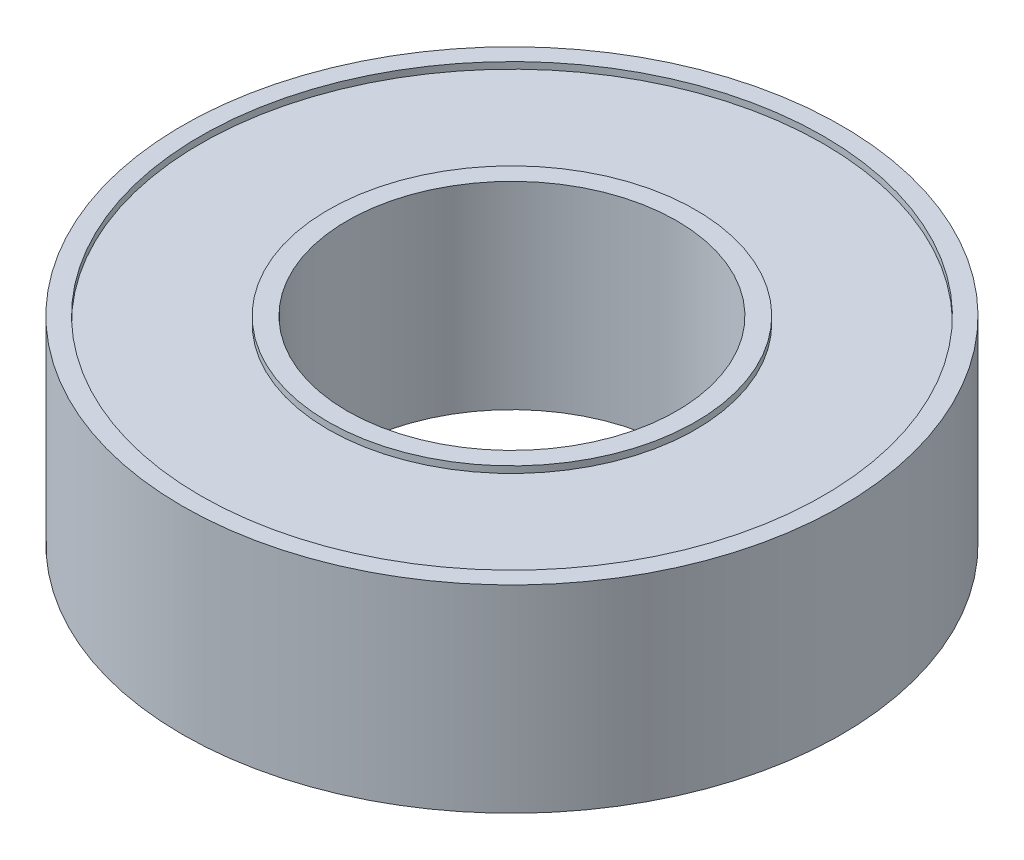
ISO-10303-21;
HEADER;
FILE_DESCRIPTION(('STEP AP214'),'2;1');
FILE_NAME('part.step','',(''),(''),'','','');
FILE_SCHEMA(('AUTOMOTIVE_DESIGN { 1 0 10303 214 1 1 1 1 }'));
ENDSEC;
DATA;
#1=APPLICATION_CONTEXT('core data for automotive mechanical design processes');
#2=APPLICATION_PROTOCOL_DEFINITION('international standard','automotive_design',2000,#1);
#3=PRODUCT_CONTEXT('',#1,'mechanical');
#4=PRODUCT('Part','Part','',(#3));
#5=PRODUCT_RELATED_PRODUCT_CATEGORY('part','',(#4));
#6=PRODUCT_DEFINITION_FORMATION('','',#4);
#7=PRODUCT_DEFINITION_CONTEXT('part definition',#1,'design');
#8=PRODUCT_DEFINITION('design','',#6,#7);
#9=PRODUCT_DEFINITION_SHAPE('','',#8);
#10=(LENGTH_UNIT() NAMED_UNIT(*) SI_UNIT(.MILLI.,.METRE.));
#11=(NAMED_UNIT(*) PLANE_ANGLE_UNIT() SI_UNIT($,.RADIAN.));
#12=(NAMED_UNIT(*) SI_UNIT($,.STERADIAN.) SOLID_ANGLE_UNIT());
#13=UNCERTAINTY_MEASURE_WITH_UNIT(LENGTH_MEASURE(1.E-05),#10,'distance_accuracy_value','');
#14=(GEOMETRIC_REPRESENTATION_CONTEXT(3) GLOBAL_UNCERTAINTY_ASSIGNED_CONTEXT((#13)) GLOBAL_UNIT_ASSIGNED_CONTEXT((#10,
#11,#12)) REPRESENTATION_CONTEXT('',''));
#15=CARTESIAN_POINT('',(0.,0.,0.));
#16=DIRECTION('',(0.,0.,1.));
#17=DIRECTION('',(1.,0.,0.));
#18=AXIS2_PLACEMENT_3D('',#15,#16,#17);
#19=CARTESIAN_POINT('',(0.,3.,0.));
#20=DIRECTION('',(0.,1.,0.));
#21=DIRECTION('',(0.,0.,1.));
#22=AXIS2_PLACEMENT_3D('',#19,#20,#21);
#23=PLANE('',#22);
#24=CARTESIAN_POINT('',(0.,3.,0.));
#25=DIRECTION('',(0.,1.,0.));
#26=DIRECTION('',(0.,0.,1.));
#27=AXIS2_PLACEMENT_3D('',#24,#25,#26);
#28=CIRCLE('',#27,2.5);
#29=CARTESIAN_POINT('',(0.,3.,2.5));
#30=VERTEX_POINT('',#29);
#31=EDGE_CURVE('E50',#30,#30,#28,.T.);
#32=ORIENTED_EDGE('',*,*,#31,.F.);
#33=EDGE_LOOP('',(#32));
#34=FACE_BOUND('',#33,.T.);
#35=CARTESIAN_POINT('',(0.,3.,0.));
#36=DIRECTION('',(0.,1.,0.));
#37=DIRECTION('',(0.,0.,1.));
#38=AXIS2_PLACEMENT_3D('',#35,#36,#37);
#39=CIRCLE('',#38,2.78728207243024);
#40=CARTESIAN_POINT('',(0.,3.,2.78728207243024));
#41=VERTEX_POINT('',#40);
#42=EDGE_CURVE('E84',#41,#41,#39,.T.);
#43=ORIENTED_EDGE('',*,*,#42,.T.);
#44=EDGE_LOOP('',(#43));
#45=FACE_BOUND('',#44,.T.);
#46=ADVANCED_FACE('F37',(#34,#45),#23,.T.);
#47=CARTESIAN_POINT('',(0.,0.,0.));
#48=DIRECTION('',(0.,1.,0.));
#49=DIRECTION('',(0.,0.,1.));
#50=AXIS2_PLACEMENT_3D('',#47,#48,#49);
#51=PLANE('',#50);
#52=CARTESIAN_POINT('',(0.,0.,0.));
#53=DIRECTION('',(0.,1.,0.));
#54=DIRECTION('',(0.,0.,1.));
#55=AXIS2_PLACEMENT_3D('',#52,#53,#54);
#56=CIRCLE('',#55,2.5);
#57=CARTESIAN_POINT('',(0.,0.,2.5));
#58=VERTEX_POINT('',#57);
#59=EDGE_CURVE('E52',#58,#58,#56,.T.);
#60=ORIENTED_EDGE('',*,*,#59,.T.);
#61=EDGE_LOOP('',(#60));
#62=FACE_BOUND('',#61,.T.);
#63=CARTESIAN_POINT('',(0.,0.,0.));
#64=DIRECTION('',(0.,-1.,0.));
#65=DIRECTION('',(0.,0.,-1.));
#66=AXIS2_PLACEMENT_3D('',#63,#64,#65);
#67=CIRCLE('',#66,2.78728207243024);
#68=CARTESIAN_POINT('',(0.,0.,-2.78728207243024));
#69=VERTEX_POINT('',#68);
#70=EDGE_CURVE('E68',#69,#69,#67,.T.);
#71=ORIENTED_EDGE('',*,*,#70,.T.);
#72=EDGE_LOOP('',(#71));
#73=FACE_BOUND('',#72,.T.);
#74=ADVANCED_FACE('F111',(#62,#73),#51,.F.);
#75=CARTESIAN_POINT('',(0.,3.,0.));
#76=DIRECTION('',(0.,1.,0.));
#77=DIRECTION('',(0.,0.,1.));
#78=AXIS2_PLACEMENT_3D('',#75,#76,#77);
#79=CIRCLE('',#78,4.72518957894101);
#80=CARTESIAN_POINT('',(0.,3.,4.72518957894101));
#81=VERTEX_POINT('',#80);
#82=EDGE_CURVE('E76',#81,#81,#79,.T.);
#83=ORIENTED_EDGE('',*,*,#82,.F.);
#84=EDGE_LOOP('',(#83));
#85=FACE_BOUND('',#84,.T.);
#86=CARTESIAN_POINT('',(0.,3.,0.));
#87=DIRECTION('',(0.,1.,0.));
#88=DIRECTION('',(0.,0.,1.));
#89=AXIS2_PLACEMENT_3D('',#86,#87,#88);
#90=CIRCLE('',#89,5.);
#91=CARTESIAN_POINT('',(0.,3.,5.));
#92=VERTEX_POINT('',#91);
#93=EDGE_CURVE('E10',#92,#92,#90,.T.);
#94=ORIENTED_EDGE('',*,*,#93,.T.);
#95=EDGE_LOOP('',(#94));
#96=FACE_BOUND('',#95,.T.);
#97=ADVANCED_FACE('F108',(#85,#96),#23,.T.);
#98=CARTESIAN_POINT('',(0.,0.,0.));
#99=DIRECTION('',(0.,-1.,0.));
#100=DIRECTION('',(0.,0.,-1.));
#101=AXIS2_PLACEMENT_3D('',#98,#99,#100);
#102=CIRCLE('',#101,4.72518957894101);
#103=CARTESIAN_POINT('',(0.,0.,-4.72518957894101));
#104=VERTEX_POINT('',#103);
#105=EDGE_CURVE('E60',#104,#104,#102,.T.);
#106=ORIENTED_EDGE('',*,*,#105,.F.);
#107=EDGE_LOOP('',(#106));
#108=FACE_BOUND('',#107,.T.);
#109=CARTESIAN_POINT('',(0.,0.,0.));
#110=DIRECTION('',(0.,1.,0.));
#111=DIRECTION('',(0.,0.,1.));
#112=AXIS2_PLACEMENT_3D('',#109,#110,#111);
#113=CIRCLE('',#112,5.);
#114=CARTESIAN_POINT('',(0.,0.,5.));
#115=VERTEX_POINT('',#114);
#116=EDGE_CURVE('E41',#115,#115,#113,.T.);
#117=ORIENTED_EDGE('',*,*,#116,.F.);
#118=EDGE_LOOP('',(#117));
#119=FACE_BOUND('',#118,.T.);
#120=ADVANCED_FACE('F110',(#108,#119),#51,.F.);
#121=CARTESIAN_POINT('',(0.,3.,0.));
#122=DIRECTION('',(0.,-1.,0.));
#123=DIRECTION('',(0.,0.,-1.));
#124=AXIS2_PLACEMENT_3D('',#121,#122,#123);
#125=CYLINDRICAL_SURFACE('',#124,5.);
#126=ORIENTED_EDGE('',*,*,#93,.F.);
#127=EDGE_LOOP('',(#126));
#128=FACE_BOUND('',#127,.T.);
#129=ORIENTED_EDGE('',*,*,#116,.T.);
#130=EDGE_LOOP('',(#129));
#131=FACE_BOUND('',#130,.T.);
#132=ADVANCED_FACE('F39',(#128,#131),#125,.T.);
#133=CARTESIAN_POINT('',(0.,3.,0.));
#134=DIRECTION('',(0.,-1.,0.));
#135=DIRECTION('',(0.,0.,-1.));
#136=AXIS2_PLACEMENT_3D('',#133,#134,#135);
#137=CYLINDRICAL_SURFACE('',#136,2.5);
#138=ORIENTED_EDGE('',*,*,#31,.T.);
#139=EDGE_LOOP('',(#138));
#140=FACE_BOUND('',#139,.T.);
#141=ORIENTED_EDGE('',*,*,#59,.F.);
#142=EDGE_LOOP('',(#141));
#143=FACE_BOUND('',#142,.T.);
#144=ADVANCED_FACE('F141',(#140,#143),#137,.F.);
#145=CARTESIAN_POINT('',(0.,0.1,0.));
#146=DIRECTION('',(0.,-1.,0.));
#147=DIRECTION('',(0.,0.,-1.));
#148=AXIS2_PLACEMENT_3D('',#145,#146,#147);
#149=CYLINDRICAL_SURFACE('',#148,4.72518957894101);
#150=CARTESIAN_POINT('',(0.,0.1,0.));
#151=DIRECTION('',(0.,-1.,0.));
#152=DIRECTION('',(0.,0.,-1.));
#153=AXIS2_PLACEMENT_3D('',#150,#151,#152);
#154=CIRCLE('',#153,4.72518957894101);
#155=CARTESIAN_POINT('',(0.,0.1,-4.72518957894101));
#156=VERTEX_POINT('',#155);
#157=EDGE_CURVE('E56',#156,#156,#154,.T.);
#158=ORIENTED_EDGE('',*,*,#157,.F.);
#159=EDGE_LOOP('',(#158));
#160=FACE_BOUND('',#159,.T.);
#161=ORIENTED_EDGE('',*,*,#105,.T.);
#162=EDGE_LOOP('',(#161));
#163=FACE_BOUND('',#162,.T.);
#164=ADVANCED_FACE('F138',(#160,#163),#149,.F.);
#165=CARTESIAN_POINT('',(0.,0.1,0.));
#166=DIRECTION('',(0.,-1.,0.));
#167=DIRECTION('',(0.,0.,-1.));
#168=AXIS2_PLACEMENT_3D('',#165,#166,#167);
#169=PLANE('',#168);
#170=CARTESIAN_POINT('',(0.,0.1,0.));
#171=DIRECTION('',(0.,-1.,0.));
#172=DIRECTION('',(0.,0.,-1.));
#173=AXIS2_PLACEMENT_3D('',#170,#171,#172);
#174=CIRCLE('',#173,2.78728207243024);
#175=CARTESIAN_POINT('',(0.,0.1,-2.78728207243024));
#176=VERTEX_POINT('',#175);
#177=EDGE_CURVE('E64',#176,#176,#174,.T.);
#178=ORIENTED_EDGE('',*,*,#177,.F.);
#179=EDGE_LOOP('',(#178));
#180=FACE_BOUND('',#179,.T.);
#181=ORIENTED_EDGE('',*,*,#157,.T.);
#182=EDGE_LOOP('',(#181));
#183=FACE_BOUND('',#182,.T.);
#184=ADVANCED_FACE('F134',(#180,#183),#169,.T.);
#185=CARTESIAN_POINT('',(0.,0.1,0.));
#186=DIRECTION('',(0.,-1.,0.));
#187=DIRECTION('',(0.,0.,-1.));
#188=AXIS2_PLACEMENT_3D('',#185,#186,#187);
#189=CYLINDRICAL_SURFACE('',#188,2.78728207243024);
#190=ORIENTED_EDGE('',*,*,#177,.T.);
#191=EDGE_LOOP('',(#190));
#192=FACE_BOUND('',#191,.T.);
#193=ORIENTED_EDGE('',*,*,#70,.F.);
#194=EDGE_LOOP('',(#193));
#195=FACE_BOUND('',#194,.T.);
#196=ADVANCED_FACE('F104',(#192,#195),#189,.T.);
#197=CARTESIAN_POINT('',(0.,2.9,0.));
#198=DIRECTION('',(0.,1.,0.));
#199=DIRECTION('',(0.,0.,1.));
#200=AXIS2_PLACEMENT_3D('',#197,#198,#199);
#201=CYLINDRICAL_SURFACE('',#200,4.72518957894101);
#202=CARTESIAN_POINT('',(0.,2.9,0.));
#203=DIRECTION('',(0.,1.,0.));
#204=DIRECTION('',(0.,0.,1.));
#205=AXIS2_PLACEMENT_3D('',#202,#203,#204);
#206=CIRCLE('',#205,4.72518957894101);
#207=CARTESIAN_POINT('',(0.,2.9,4.72518957894101));
#208=VERTEX_POINT('',#207);
#209=EDGE_CURVE('E72',#208,#208,#206,.T.);
#210=ORIENTED_EDGE('',*,*,#209,.F.);
#211=EDGE_LOOP('',(#210));
#212=FACE_BOUND('',#211,.T.);
#213=ORIENTED_EDGE('',*,*,#82,.T.);
#214=EDGE_LOOP('',(#213));
#215=FACE_BOUND('',#214,.T.);
#216=ADVANCED_FACE('F98',(#212,#215),#201,.F.);
#217=CARTESIAN_POINT('',(0.,2.9,0.));
#218=DIRECTION('',(0.,1.,0.));
#219=DIRECTION('',(0.,0.,1.));
#220=AXIS2_PLACEMENT_3D('',#217,#218,#219);
#221=PLANE('',#220);
#222=CARTESIAN_POINT('',(0.,2.9,0.));
#223=DIRECTION('',(0.,1.,0.));
#224=DIRECTION('',(0.,0.,1.));
#225=AXIS2_PLACEMENT_3D('',#222,#223,#224);
#226=CIRCLE('',#225,2.78728207243024);
#227=CARTESIAN_POINT('',(0.,2.9,2.78728207243024));
#228=VERTEX_POINT('',#227);
#229=EDGE_CURVE('E80',#228,#228,#226,.T.);
#230=ORIENTED_EDGE('',*,*,#229,.F.);
#231=EDGE_LOOP('',(#230));
#232=FACE_BOUND('',#231,.T.);
#233=ORIENTED_EDGE('',*,*,#209,.T.);
#234=EDGE_LOOP('',(#233));
#235=FACE_BOUND('',#234,.T.);
#236=ADVANCED_FACE('F95',(#232,#235),#221,.T.);
#237=CARTESIAN_POINT('',(0.,2.9,0.));
#238=DIRECTION('',(0.,1.,0.));
#239=DIRECTION('',(0.,0.,1.));
#240=AXIS2_PLACEMENT_3D('',#237,#238,#239);
#241=CYLINDRICAL_SURFACE('',#240,2.78728207243024);
#242=ORIENTED_EDGE('',*,*,#229,.T.);
#243=EDGE_LOOP('',(#242));
#244=FACE_BOUND('',#243,.T.);
#245=ORIENTED_EDGE('',*,*,#42,.F.);
#246=EDGE_LOOP('',(#245));
#247=FACE_BOUND('',#246,.T.);
#248=ADVANCED_FACE('F92',(#244,#247),#241,.T.);
#249=CLOSED_SHELL('',(#46,#74,#97,#120,#132,#144,#164,#184,#196,#216,#236,#248));
#250=MANIFOLD_SOLID_BREP('B2',#249);
#251=ADVANCED_BREP_SHAPE_REPRESENTATION('',(#18,#250),#14);
#252=SHAPE_DEFINITION_REPRESENTATION(#9,#251);
ENDSEC;
END-ISO-10303-21;
